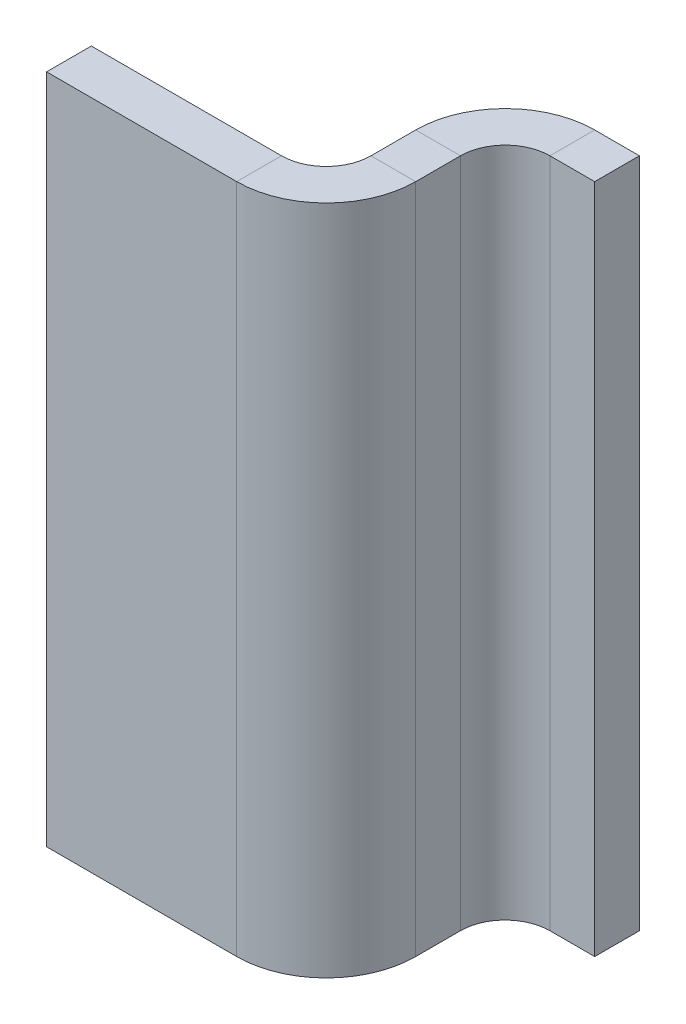
ISO-10303-21;
HEADER;
FILE_DESCRIPTION(('STEP AP214'),'2;1');
FILE_NAME('part.step','',(''),(''),'','','');
FILE_SCHEMA(('AUTOMOTIVE_DESIGN { 1 0 10303 214 1 1 1 1 }'));
ENDSEC;
DATA;
#1=APPLICATION_CONTEXT('core data for automotive mechanical design processes');
#2=APPLICATION_PROTOCOL_DEFINITION('international standard','automotive_design',2000,#1);
#3=PRODUCT_CONTEXT('',#1,'mechanical');
#4=PRODUCT('Part','Part','',(#3));
#5=PRODUCT_RELATED_PRODUCT_CATEGORY('part','',(#4));
#6=PRODUCT_DEFINITION_FORMATION('','',#4);
#7=PRODUCT_DEFINITION_CONTEXT('part definition',#1,'design');
#8=PRODUCT_DEFINITION('design','',#6,#7);
#9=PRODUCT_DEFINITION_SHAPE('','',#8);
#10=(LENGTH_UNIT() NAMED_UNIT(*) SI_UNIT(.MILLI.,.METRE.));
#11=(NAMED_UNIT(*) PLANE_ANGLE_UNIT() SI_UNIT($,.RADIAN.));
#12=(NAMED_UNIT(*) SI_UNIT($,.STERADIAN.) SOLID_ANGLE_UNIT());
#13=UNCERTAINTY_MEASURE_WITH_UNIT(LENGTH_MEASURE(1.E-05),#10,'distance_accuracy_value','');
#14=(GEOMETRIC_REPRESENTATION_CONTEXT(3) GLOBAL_UNCERTAINTY_ASSIGNED_CONTEXT((#13)) GLOBAL_UNIT_ASSIGNED_CONTEXT((#10,
#11,#12)) REPRESENTATION_CONTEXT('',''));
#15=CARTESIAN_POINT('',(0.,0.,0.));
#16=DIRECTION('',(0.,0.,1.));
#17=DIRECTION('',(1.,0.,0.));
#18=AXIS2_PLACEMENT_3D('',#15,#16,#17);
#19=CARTESIAN_POINT('',(1.65,-1.5,0.));
#20=DIRECTION('',(-1.,0.,0.));
#21=DIRECTION('',(0.,0.,1.));
#22=AXIS2_PLACEMENT_3D('',#19,#20,#21);
#23=PLANE('',#22);
#24=DIRECTION('',(0.,-1.,0.));
#25=VECTOR('',#24,1.);
#26=CARTESIAN_POINT('',(1.65,-1.5,0.));
#27=LINE('',#26,#25);
#28=CARTESIAN_POINT('',(1.65,1.5,0.));
#29=VERTEX_POINT('',#28);
#30=CARTESIAN_POINT('',(1.65,-1.5,0.));
#31=VERTEX_POINT('',#30);
#32=EDGE_CURVE('E223',#29,#31,#27,.T.);
#33=ORIENTED_EDGE('',*,*,#32,.F.);
#34=DIRECTION('',(0.,0.,-1.));
#35=VECTOR('',#34,1.);
#36=CARTESIAN_POINT('',(1.65,1.5,0.));
#37=LINE('',#36,#35);
#38=CARTESIAN_POINT('',(1.65,1.5,0.2));
#39=VERTEX_POINT('',#38);
#40=EDGE_CURVE('E11',#39,#29,#37,.T.);
#41=ORIENTED_EDGE('',*,*,#40,.F.);
#42=DIRECTION('',(0.,1.,0.));
#43=VECTOR('',#42,1.);
#44=CARTESIAN_POINT('',(1.65,1.5,0.2));
#45=LINE('',#44,#43);
#46=CARTESIAN_POINT('',(1.65,-1.5,0.2));
#47=VERTEX_POINT('',#46);
#48=EDGE_CURVE('E159',#47,#39,#45,.T.);
#49=ORIENTED_EDGE('',*,*,#48,.F.);
#50=DIRECTION('',(0.,0.,1.));
#51=VECTOR('',#50,1.);
#52=CARTESIAN_POINT('',(1.65,-1.5,0.2));
#53=LINE('',#52,#51);
#54=EDGE_CURVE('E240',#31,#47,#53,.T.);
#55=ORIENTED_EDGE('',*,*,#54,.F.);
#56=EDGE_LOOP('',(#33,#41,#49,#55));
#57=FACE_BOUND('',#56,.T.);
#58=ADVANCED_FACE('F16',(#57),#23,.F.);
#59=CARTESIAN_POINT('',(1.45,1.5,0.));
#60=DIRECTION('',(0.,-1.,0.));
#61=DIRECTION('',(0.,0.,-1.));
#62=AXIS2_PLACEMENT_3D('',#59,#60,#61);
#63=PLANE('',#62);
#64=ORIENTED_EDGE('',*,*,#40,.T.);
#65=DIRECTION('',(1.,0.,0.));
#66=VECTOR('',#65,1.);
#67=CARTESIAN_POINT('',(1.45,1.5,0.));
#68=LINE('',#67,#66);
#69=CARTESIAN_POINT('',(1.45,1.5,0.));
#70=VERTEX_POINT('',#69);
#71=EDGE_CURVE('E234',#70,#29,#68,.T.);
#72=ORIENTED_EDGE('',*,*,#71,.F.);
#73=DIRECTION('',(0.,0.,-1.));
#74=VECTOR('',#73,1.);
#75=CARTESIAN_POINT('',(1.45,1.5,0.));
#76=LINE('',#75,#74);
#77=CARTESIAN_POINT('',(1.45,1.5,0.2));
#78=VERTEX_POINT('',#77);
#79=EDGE_CURVE('E27',#78,#70,#76,.T.);
#80=ORIENTED_EDGE('',*,*,#79,.F.);
#81=DIRECTION('',(1.,0.,0.));
#82=VECTOR('',#81,1.);
#83=CARTESIAN_POINT('',(1.45,1.5,0.2));
#84=LINE('',#83,#82);
#85=EDGE_CURVE('E202',#78,#39,#84,.T.);
#86=ORIENTED_EDGE('',*,*,#85,.T.);
#87=EDGE_LOOP('',(#64,#72,#80,#86));
#88=FACE_BOUND('',#87,.T.);
#89=ADVANCED_FACE('F344',(#88),#63,.F.);
#90=CARTESIAN_POINT('',(1.237867965644,1.5,0.187867965644));
#91=DIRECTION('',(0.,1.,0.));
#92=DIRECTION('',(1.,0.,0.));
#93=AXIS2_PLACEMENT_3D('',#90,#91,#92);
#94=PLANE('',#93);
#95=CARTESIAN_POINT('',(1.45,1.5,0.4));
#96=DIRECTION('',(0.,-1.,0.));
#97=DIRECTION('',(0.,0.,-1.));
#98=AXIS2_PLACEMENT_3D('',#95,#96,#97);
#99=CIRCLE('',#98,0.2);
#100=CARTESIAN_POINT('',(1.25,1.5,0.4));
#101=VERTEX_POINT('',#100);
#102=EDGE_CURVE('E142',#101,#78,#99,.T.);
#103=ORIENTED_EDGE('',*,*,#102,.T.);
#104=ORIENTED_EDGE('',*,*,#79,.T.);
#105=CARTESIAN_POINT('',(1.45,1.5,0.4));
#106=DIRECTION('',(0.,-1.,0.));
#107=DIRECTION('',(0.,0.,-1.));
#108=AXIS2_PLACEMENT_3D('',#105,#106,#107);
#109=CIRCLE('',#108,0.4);
#110=CARTESIAN_POINT('',(1.05,1.5,0.4));
#111=VERTEX_POINT('',#110);
#112=EDGE_CURVE('E20',#111,#70,#109,.T.);
#113=ORIENTED_EDGE('',*,*,#112,.F.);
#114=DIRECTION('',(-1.,0.,0.));
#115=VECTOR('',#114,1.);
#116=CARTESIAN_POINT('',(1.05,1.5,0.4));
#117=LINE('',#116,#115);
#118=EDGE_CURVE('E139',#101,#111,#117,.T.);
#119=ORIENTED_EDGE('',*,*,#118,.F.);
#120=EDGE_LOOP('',(#103,#104,#113,#119));
#121=FACE_BOUND('',#120,.T.);
#122=ADVANCED_FACE('F141',(#121),#94,.T.);
#123=CARTESIAN_POINT('',(1.05,1.5,0.6));
#124=DIRECTION('',(0.,-1.,0.));
#125=DIRECTION('',(0.,0.,-1.));
#126=AXIS2_PLACEMENT_3D('',#123,#124,#125);
#127=PLANE('',#126);
#128=ORIENTED_EDGE('',*,*,#118,.T.);
#129=DIRECTION('',(0.,0.,-1.));
#130=VECTOR('',#129,1.);
#131=CARTESIAN_POINT('',(1.05,1.5,0.6));
#132=LINE('',#131,#130);
#133=CARTESIAN_POINT('',(1.05,1.5,0.6));
#134=VERTEX_POINT('',#133);
#135=EDGE_CURVE('E227',#134,#111,#132,.T.);
#136=ORIENTED_EDGE('',*,*,#135,.F.);
#137=DIRECTION('',(-1.,0.,0.));
#138=VECTOR('',#137,1.);
#139=CARTESIAN_POINT('',(1.05,1.5,0.6));
#140=LINE('',#139,#138);
#141=CARTESIAN_POINT('',(1.25,1.5,0.6));
#142=VERTEX_POINT('',#141);
#143=EDGE_CURVE('E150',#142,#134,#140,.T.);
#144=ORIENTED_EDGE('',*,*,#143,.F.);
#145=DIRECTION('',(0.,0.,-1.));
#146=VECTOR('',#145,1.);
#147=CARTESIAN_POINT('',(1.25,1.5,0.6));
#148=LINE('',#147,#146);
#149=EDGE_CURVE('E162',#142,#101,#148,.T.);
#150=ORIENTED_EDGE('',*,*,#149,.T.);
#151=EDGE_LOOP('',(#128,#136,#144,#150));
#152=FACE_BOUND('',#151,.T.);
#153=ADVANCED_FACE('F163',(#152),#127,.F.);
#154=CARTESIAN_POINT('',(1.062132034356,1.5,0.812132034356));
#155=DIRECTION('',(0.,1.,0.));
#156=DIRECTION('',(1.,0.,0.));
#157=AXIS2_PLACEMENT_3D('',#154,#155,#156);
#158=PLANE('',#157);
#159=CARTESIAN_POINT('',(0.85,1.5,0.6));
#160=DIRECTION('',(0.,1.,0.));
#161=DIRECTION('',(0.,0.,-1.));
#162=AXIS2_PLACEMENT_3D('',#159,#160,#161);
#163=CIRCLE('',#162,0.4);
#164=CARTESIAN_POINT('',(0.85,1.5,1.));
#165=VERTEX_POINT('',#164);
#166=EDGE_CURVE('E175',#165,#142,#163,.T.);
#167=ORIENTED_EDGE('',*,*,#166,.T.);
#168=ORIENTED_EDGE('',*,*,#143,.T.);
#169=CARTESIAN_POINT('',(0.85,1.5,0.6));
#170=DIRECTION('',(0.,1.,0.));
#171=DIRECTION('',(0.,0.,-1.));
#172=AXIS2_PLACEMENT_3D('',#169,#170,#171);
#173=CIRCLE('',#172,0.2);
#174=CARTESIAN_POINT('',(0.85,1.5,0.8));
#175=VERTEX_POINT('',#174);
#176=EDGE_CURVE('E264',#175,#134,#173,.T.);
#177=ORIENTED_EDGE('',*,*,#176,.F.);
#178=DIRECTION('',(0.,0.,-1.));
#179=VECTOR('',#178,1.);
#180=CARTESIAN_POINT('',(0.85,1.5,0.8));
#181=LINE('',#180,#179);
#182=EDGE_CURVE('E205',#165,#175,#181,.T.);
#183=ORIENTED_EDGE('',*,*,#182,.F.);
#184=EDGE_LOOP('',(#167,#168,#177,#183));
#185=FACE_BOUND('',#184,.T.);
#186=ADVANCED_FACE('F388',(#185),#158,.T.);
#187=CARTESIAN_POINT('',(0.,1.5,0.8));
#188=DIRECTION('',(0.,-1.,0.));
#189=DIRECTION('',(0.,0.,-1.));
#190=AXIS2_PLACEMENT_3D('',#187,#188,#189);
#191=PLANE('',#190);
#192=ORIENTED_EDGE('',*,*,#182,.T.);
#193=DIRECTION('',(1.,0.,0.));
#194=VECTOR('',#193,1.);
#195=CARTESIAN_POINT('',(0.,1.5,0.8));
#196=LINE('',#195,#194);
#197=CARTESIAN_POINT('',(0.,1.5,0.8));
#198=VERTEX_POINT('',#197);
#199=EDGE_CURVE('E215',#198,#175,#196,.T.);
#200=ORIENTED_EDGE('',*,*,#199,.F.);
#201=DIRECTION('',(0.,0.,-1.));
#202=VECTOR('',#201,1.);
#203=CARTESIAN_POINT('',(0.,1.5,0.8));
#204=LINE('',#203,#202);
#205=CARTESIAN_POINT('',(0.,1.5,1.));
#206=VERTEX_POINT('',#205);
#207=EDGE_CURVE('E201',#206,#198,#204,.T.);
#208=ORIENTED_EDGE('',*,*,#207,.F.);
#209=DIRECTION('',(1.,0.,0.));
#210=VECTOR('',#209,1.);
#211=CARTESIAN_POINT('',(0.,1.5,1.));
#212=LINE('',#211,#210);
#213=EDGE_CURVE('E252',#206,#165,#212,.T.);
#214=ORIENTED_EDGE('',*,*,#213,.T.);
#215=EDGE_LOOP('',(#192,#200,#208,#214));
#216=FACE_BOUND('',#215,.T.);
#217=ADVANCED_FACE('F298',(#216),#191,.F.);
#218=CARTESIAN_POINT('',(1.45,1.5,0.2));
#219=DIRECTION('',(0.,0.,-1.));
#220=DIRECTION('',(0.,-1.,0.));
#221=AXIS2_PLACEMENT_3D('',#218,#219,#220);
#222=PLANE('',#221);
#223=ORIENTED_EDGE('',*,*,#48,.T.);
#224=ORIENTED_EDGE('',*,*,#85,.F.);
#225=DIRECTION('',(0.,-1.,0.));
#226=VECTOR('',#225,1.);
#227=CARTESIAN_POINT('',(1.45,1.5,0.2));
#228=LINE('',#227,#226);
#229=CARTESIAN_POINT('',(1.45,-1.5,0.2));
#230=VERTEX_POINT('',#229);
#231=EDGE_CURVE('E157',#78,#230,#228,.T.);
#232=ORIENTED_EDGE('',*,*,#231,.T.);
#233=DIRECTION('',(1.,0.,0.));
#234=VECTOR('',#233,1.);
#235=CARTESIAN_POINT('',(1.45,-1.5,0.2));
#236=LINE('',#235,#234);
#237=EDGE_CURVE('E244',#230,#47,#236,.T.);
#238=ORIENTED_EDGE('',*,*,#237,.T.);
#239=EDGE_LOOP('',(#223,#224,#232,#238));
#240=FACE_BOUND('',#239,.T.);
#241=ADVANCED_FACE('F401',(#240),#222,.F.);
#242=CARTESIAN_POINT('',(1.45,1.5,0.4));
#243=DIRECTION('',(0.,-1.,0.));
#244=DIRECTION('',(0.,0.,-1.));
#245=AXIS2_PLACEMENT_3D('',#242,#243,#244);
#246=CYLINDRICAL_SURFACE('',#245,0.2);
#247=ORIENTED_EDGE('',*,*,#231,.F.);
#248=ORIENTED_EDGE('',*,*,#102,.F.);
#249=DIRECTION('',(0.,1.,0.));
#250=VECTOR('',#249,1.);
#251=CARTESIAN_POINT('',(1.25,1.5,0.4));
#252=LINE('',#251,#250);
#253=CARTESIAN_POINT('',(1.25,-1.5,0.4));
#254=VERTEX_POINT('',#253);
#255=EDGE_CURVE('E155',#254,#101,#252,.T.);
#256=ORIENTED_EDGE('',*,*,#255,.F.);
#257=CARTESIAN_POINT('',(1.45,-1.5,0.4));
#258=DIRECTION('',(0.,-1.,0.));
#259=DIRECTION('',(0.,0.,-1.));
#260=AXIS2_PLACEMENT_3D('',#257,#258,#259);
#261=CIRCLE('',#260,0.2);
#262=EDGE_CURVE('E237',#254,#230,#261,.T.);
#263=ORIENTED_EDGE('',*,*,#262,.T.);
#264=EDGE_LOOP('',(#247,#248,#256,#263));
#265=FACE_BOUND('',#264,.T.);
#266=ADVANCED_FACE('F18',(#265),#246,.F.);
#267=CARTESIAN_POINT('',(1.25,1.5,0.6));
#268=DIRECTION('',(-1.,0.,0.));
#269=DIRECTION('',(0.,0.,1.));
#270=AXIS2_PLACEMENT_3D('',#267,#268,#269);
#271=PLANE('',#270);
#272=ORIENTED_EDGE('',*,*,#255,.T.);
#273=ORIENTED_EDGE('',*,*,#149,.F.);
#274=DIRECTION('',(0.,1.,0.));
#275=VECTOR('',#274,1.);
#276=CARTESIAN_POINT('',(1.25,1.5,0.6));
#277=LINE('',#276,#275);
#278=CARTESIAN_POINT('',(1.25,-1.5,0.6));
#279=VERTEX_POINT('',#278);
#280=EDGE_CURVE('E181',#279,#142,#277,.T.);
#281=ORIENTED_EDGE('',*,*,#280,.F.);
#282=DIRECTION('',(0.,0.,-1.));
#283=VECTOR('',#282,1.);
#284=CARTESIAN_POINT('',(1.25,-1.5,0.6));
#285=LINE('',#284,#283);
#286=EDGE_CURVE('E172',#279,#254,#285,.T.);
#287=ORIENTED_EDGE('',*,*,#286,.T.);
#288=EDGE_LOOP('',(#272,#273,#281,#287));
#289=FACE_BOUND('',#288,.T.);
#290=ADVANCED_FACE('F170',(#289),#271,.F.);
#291=CARTESIAN_POINT('',(0.85,1.5,0.6));
#292=DIRECTION('',(0.,1.,0.));
#293=DIRECTION('',(0.,0.,-1.));
#294=AXIS2_PLACEMENT_3D('',#291,#292,#293);
#295=CYLINDRICAL_SURFACE('',#294,0.4);
#296=CARTESIAN_POINT('',(0.85,-1.5,0.6));
#297=DIRECTION('',(0.,1.,0.));
#298=DIRECTION('',(0.,0.,-1.));
#299=AXIS2_PLACEMENT_3D('',#296,#297,#298);
#300=CIRCLE('',#299,0.4);
#301=CARTESIAN_POINT('',(0.85,-1.5,1.));
#302=VERTEX_POINT('',#301);
#303=EDGE_CURVE('E226',#302,#279,#300,.T.);
#304=ORIENTED_EDGE('',*,*,#303,.T.);
#305=ORIENTED_EDGE('',*,*,#280,.T.);
#306=ORIENTED_EDGE('',*,*,#166,.F.);
#307=DIRECTION('',(0.,1.,0.));
#308=VECTOR('',#307,1.);
#309=CARTESIAN_POINT('',(0.85,1.5,1.));
#310=LINE('',#309,#308);
#311=EDGE_CURVE('E248',#302,#165,#310,.T.);
#312=ORIENTED_EDGE('',*,*,#311,.F.);
#313=EDGE_LOOP('',(#304,#305,#306,#312));
#314=FACE_BOUND('',#313,.T.);
#315=ADVANCED_FACE('F339',(#314),#295,.T.);
#316=CARTESIAN_POINT('',(0.,1.5,1.));
#317=DIRECTION('',(0.,0.,-1.));
#318=DIRECTION('',(0.,-1.,0.));
#319=AXIS2_PLACEMENT_3D('',#316,#317,#318);
#320=PLANE('',#319);
#321=ORIENTED_EDGE('',*,*,#311,.T.);
#322=ORIENTED_EDGE('',*,*,#213,.F.);
#323=DIRECTION('',(0.,1.,0.));
#324=VECTOR('',#323,1.);
#325=CARTESIAN_POINT('',(0.,1.5,1.));
#326=LINE('',#325,#324);
#327=CARTESIAN_POINT('',(0.,-1.5,1.));
#328=VERTEX_POINT('',#327);
#329=EDGE_CURVE('E190',#328,#206,#326,.T.);
#330=ORIENTED_EDGE('',*,*,#329,.F.);
#331=DIRECTION('',(1.,0.,0.));
#332=VECTOR('',#331,1.);
#333=CARTESIAN_POINT('',(0.,-1.5,1.));
#334=LINE('',#333,#332);
#335=EDGE_CURVE('E307',#328,#302,#334,.T.);
#336=ORIENTED_EDGE('',*,*,#335,.T.);
#337=EDGE_LOOP('',(#321,#322,#330,#336));
#338=FACE_BOUND('',#337,.T.);
#339=ADVANCED_FACE('F310',(#338),#320,.F.);
#340=CARTESIAN_POINT('',(1.45,-1.5,0.2));
#341=DIRECTION('',(0.,1.,0.));
#342=DIRECTION('',(1.,0.,0.));
#343=AXIS2_PLACEMENT_3D('',#340,#341,#342);
#344=PLANE('',#343);
#345=ORIENTED_EDGE('',*,*,#54,.T.);
#346=ORIENTED_EDGE('',*,*,#237,.F.);
#347=DIRECTION('',(0.,0.,1.));
#348=VECTOR('',#347,1.);
#349=CARTESIAN_POINT('',(1.45,-1.5,0.2));
#350=LINE('',#349,#348);
#351=CARTESIAN_POINT('',(1.45,-1.5,0.));
#352=VERTEX_POINT('',#351);
#353=EDGE_CURVE('E74',#352,#230,#350,.T.);
#354=ORIENTED_EDGE('',*,*,#353,.F.);
#355=DIRECTION('',(1.,0.,0.));
#356=VECTOR('',#355,1.);
#357=CARTESIAN_POINT('',(1.45,-1.5,0.));
#358=LINE('',#357,#356);
#359=EDGE_CURVE('E231',#352,#31,#358,.T.);
#360=ORIENTED_EDGE('',*,*,#359,.T.);
#361=EDGE_LOOP('',(#345,#346,#354,#360));
#362=FACE_BOUND('',#361,.T.);
#363=ADVANCED_FACE('F327',(#362),#344,.F.);
#364=CARTESIAN_POINT('',(1.237867965644,-1.5,0.187867965644));
#365=DIRECTION('',(0.,-1.,0.));
#366=DIRECTION('',(0.,0.,-1.));
#367=AXIS2_PLACEMENT_3D('',#364,#365,#366);
#368=PLANE('',#367);
#369=CARTESIAN_POINT('',(1.45,-1.5,0.4));
#370=DIRECTION('',(0.,-1.,0.));
#371=DIRECTION('',(0.,0.,-1.));
#372=AXIS2_PLACEMENT_3D('',#369,#370,#371);
#373=CIRCLE('',#372,0.4);
#374=CARTESIAN_POINT('',(1.05,-1.5,0.4));
#375=VERTEX_POINT('',#374);
#376=EDGE_CURVE('E194',#375,#352,#373,.T.);
#377=ORIENTED_EDGE('',*,*,#376,.T.);
#378=ORIENTED_EDGE('',*,*,#353,.T.);
#379=ORIENTED_EDGE('',*,*,#262,.F.);
#380=DIRECTION('',(1.,0.,0.));
#381=VECTOR('',#380,1.);
#382=CARTESIAN_POINT('',(1.25,-1.5,0.4));
#383=LINE('',#382,#381);
#384=EDGE_CURVE('E208',#375,#254,#383,.T.);
#385=ORIENTED_EDGE('',*,*,#384,.F.);
#386=EDGE_LOOP('',(#377,#378,#379,#385));
#387=FACE_BOUND('',#386,.T.);
#388=ADVANCED_FACE('F329',(#387),#368,.T.);
#389=CARTESIAN_POINT('',(1.25,-1.5,0.6));
#390=DIRECTION('',(0.,1.,0.));
#391=DIRECTION('',(1.,0.,0.));
#392=AXIS2_PLACEMENT_3D('',#389,#390,#391);
#393=PLANE('',#392);
#394=ORIENTED_EDGE('',*,*,#384,.T.);
#395=ORIENTED_EDGE('',*,*,#286,.F.);
#396=DIRECTION('',(1.,0.,0.));
#397=VECTOR('',#396,1.);
#398=CARTESIAN_POINT('',(1.25,-1.5,0.6));
#399=LINE('',#398,#397);
#400=CARTESIAN_POINT('',(1.05,-1.5,0.6));
#401=VERTEX_POINT('',#400);
#402=EDGE_CURVE('E185',#401,#279,#399,.T.);
#403=ORIENTED_EDGE('',*,*,#402,.F.);
#404=DIRECTION('',(0.,0.,-1.));
#405=VECTOR('',#404,1.);
#406=CARTESIAN_POINT('',(1.05,-1.5,0.6));
#407=LINE('',#406,#405);
#408=EDGE_CURVE('E230',#401,#375,#407,.T.);
#409=ORIENTED_EDGE('',*,*,#408,.T.);
#410=EDGE_LOOP('',(#394,#395,#403,#409));
#411=FACE_BOUND('',#410,.T.);
#412=ADVANCED_FACE('F336',(#411),#393,.F.);
#413=CARTESIAN_POINT('',(1.062132034356,-1.5,0.812132034356));
#414=DIRECTION('',(0.,-1.,0.));
#415=DIRECTION('',(0.,0.,-1.));
#416=AXIS2_PLACEMENT_3D('',#413,#414,#415);
#417=PLANE('',#416);
#418=CARTESIAN_POINT('',(0.85,-1.5,0.6));
#419=DIRECTION('',(0.,1.,0.));
#420=DIRECTION('',(0.,0.,-1.));
#421=AXIS2_PLACEMENT_3D('',#418,#419,#420);
#422=CIRCLE('',#421,0.2);
#423=CARTESIAN_POINT('',(0.85,-1.5,0.8));
#424=VERTEX_POINT('',#423);
#425=EDGE_CURVE('E269',#424,#401,#422,.T.);
#426=ORIENTED_EDGE('',*,*,#425,.T.);
#427=ORIENTED_EDGE('',*,*,#402,.T.);
#428=ORIENTED_EDGE('',*,*,#303,.F.);
#429=DIRECTION('',(0.,0.,1.));
#430=VECTOR('',#429,1.);
#431=CARTESIAN_POINT('',(0.85,-1.5,1.));
#432=LINE('',#431,#430);
#433=EDGE_CURVE('E279',#424,#302,#432,.T.);
#434=ORIENTED_EDGE('',*,*,#433,.F.);
#435=EDGE_LOOP('',(#426,#427,#428,#434));
#436=FACE_BOUND('',#435,.T.);
#437=ADVANCED_FACE('F380',(#436),#417,.T.);
#438=CARTESIAN_POINT('',(0.,-1.5,1.));
#439=DIRECTION('',(0.,1.,0.));
#440=DIRECTION('',(1.,0.,0.));
#441=AXIS2_PLACEMENT_3D('',#438,#439,#440);
#442=PLANE('',#441);
#443=ORIENTED_EDGE('',*,*,#433,.T.);
#444=ORIENTED_EDGE('',*,*,#335,.F.);
#445=DIRECTION('',(0.,0.,1.));
#446=VECTOR('',#445,1.);
#447=CARTESIAN_POINT('',(0.,-1.5,1.));
#448=LINE('',#447,#446);
#449=CARTESIAN_POINT('',(0.,-1.5,0.8));
#450=VERTEX_POINT('',#449);
#451=EDGE_CURVE('E187',#450,#328,#448,.T.);
#452=ORIENTED_EDGE('',*,*,#451,.F.);
#453=DIRECTION('',(1.,0.,0.));
#454=VECTOR('',#453,1.);
#455=CARTESIAN_POINT('',(0.,-1.5,0.8));
#456=LINE('',#455,#454);
#457=EDGE_CURVE('E211',#450,#424,#456,.T.);
#458=ORIENTED_EDGE('',*,*,#457,.T.);
#459=EDGE_LOOP('',(#443,#444,#452,#458));
#460=FACE_BOUND('',#459,.T.);
#461=ADVANCED_FACE('F305',(#460),#442,.F.);
#462=CARTESIAN_POINT('',(1.45,-1.5,0.));
#463=DIRECTION('',(0.,0.,1.));
#464=DIRECTION('',(1.,0.,0.));
#465=AXIS2_PLACEMENT_3D('',#462,#463,#464);
#466=PLANE('',#465);
#467=ORIENTED_EDGE('',*,*,#32,.T.);
#468=ORIENTED_EDGE('',*,*,#359,.F.);
#469=DIRECTION('',(0.,-1.,0.));
#470=VECTOR('',#469,1.);
#471=CARTESIAN_POINT('',(1.45,-1.5,0.));
#472=LINE('',#471,#470);
#473=EDGE_CURVE('E191',#70,#352,#472,.T.);
#474=ORIENTED_EDGE('',*,*,#473,.F.);
#475=ORIENTED_EDGE('',*,*,#71,.T.);
#476=EDGE_LOOP('',(#467,#468,#474,#475));
#477=FACE_BOUND('',#476,.T.);
#478=ADVANCED_FACE('F325',(#477),#466,.F.);
#479=CARTESIAN_POINT('',(1.45,-1.5,0.4));
#480=DIRECTION('',(0.,-1.,0.));
#481=DIRECTION('',(0.,0.,-1.));
#482=AXIS2_PLACEMENT_3D('',#479,#480,#481);
#483=CYLINDRICAL_SURFACE('',#482,0.4);
#484=ORIENTED_EDGE('',*,*,#112,.T.);
#485=ORIENTED_EDGE('',*,*,#473,.T.);
#486=ORIENTED_EDGE('',*,*,#376,.F.);
#487=DIRECTION('',(0.,-1.,0.));
#488=VECTOR('',#487,1.);
#489=CARTESIAN_POINT('',(1.05,-1.5,0.4));
#490=LINE('',#489,#488);
#491=EDGE_CURVE('E261',#111,#375,#490,.T.);
#492=ORIENTED_EDGE('',*,*,#491,.F.);
#493=EDGE_LOOP('',(#484,#485,#486,#492));
#494=FACE_BOUND('',#493,.T.);
#495=ADVANCED_FACE('F362',(#494),#483,.T.);
#496=CARTESIAN_POINT('',(1.05,-1.5,0.6));
#497=DIRECTION('',(1.,0.,0.));
#498=DIRECTION('',(0.,1.,0.));
#499=AXIS2_PLACEMENT_3D('',#496,#497,#498);
#500=PLANE('',#499);
#501=ORIENTED_EDGE('',*,*,#491,.T.);
#502=ORIENTED_EDGE('',*,*,#408,.F.);
#503=DIRECTION('',(0.,1.,0.));
#504=VECTOR('',#503,1.);
#505=CARTESIAN_POINT('',(1.05,-1.5,0.6));
#506=LINE('',#505,#504);
#507=EDGE_CURVE('E219',#401,#134,#506,.T.);
#508=ORIENTED_EDGE('',*,*,#507,.T.);
#509=ORIENTED_EDGE('',*,*,#135,.T.);
#510=EDGE_LOOP('',(#501,#502,#508,#509));
#511=FACE_BOUND('',#510,.T.);
#512=ADVANCED_FACE('F359',(#511),#500,.F.);
#513=CARTESIAN_POINT('',(0.85,-1.5,0.6));
#514=DIRECTION('',(0.,1.,0.));
#515=DIRECTION('',(0.,0.,-1.));
#516=AXIS2_PLACEMENT_3D('',#513,#514,#515);
#517=CYLINDRICAL_SURFACE('',#516,0.2);
#518=ORIENTED_EDGE('',*,*,#507,.F.);
#519=ORIENTED_EDGE('',*,*,#425,.F.);
#520=DIRECTION('',(0.,-1.,0.));
#521=VECTOR('',#520,1.);
#522=CARTESIAN_POINT('',(0.85,-1.5,0.8));
#523=LINE('',#522,#521);
#524=EDGE_CURVE('E200',#175,#424,#523,.T.);
#525=ORIENTED_EDGE('',*,*,#524,.F.);
#526=ORIENTED_EDGE('',*,*,#176,.T.);
#527=EDGE_LOOP('',(#518,#519,#525,#526));
#528=FACE_BOUND('',#527,.T.);
#529=ADVANCED_FACE('F355',(#528),#517,.F.);
#530=CARTESIAN_POINT('',(0.,-1.5,0.8));
#531=DIRECTION('',(0.,0.,1.));
#532=DIRECTION('',(1.,0.,0.));
#533=AXIS2_PLACEMENT_3D('',#530,#531,#532);
#534=PLANE('',#533);
#535=ORIENTED_EDGE('',*,*,#524,.T.);
#536=ORIENTED_EDGE('',*,*,#457,.F.);
#537=DIRECTION('',(0.,-1.,0.));
#538=VECTOR('',#537,1.);
#539=CARTESIAN_POINT('',(0.,-1.5,0.8));
#540=LINE('',#539,#538);
#541=EDGE_CURVE('E196',#198,#450,#540,.T.);
#542=ORIENTED_EDGE('',*,*,#541,.F.);
#543=ORIENTED_EDGE('',*,*,#199,.T.);
#544=EDGE_LOOP('',(#535,#536,#542,#543));
#545=FACE_BOUND('',#544,.T.);
#546=ADVANCED_FACE('F302',(#545),#534,.F.);
#547=CARTESIAN_POINT('',(0.,-1.5,0.8));
#548=DIRECTION('',(-1.,0.,0.));
#549=DIRECTION('',(0.,0.,1.));
#550=AXIS2_PLACEMENT_3D('',#547,#548,#549);
#551=PLANE('',#550);
#552=ORIENTED_EDGE('',*,*,#451,.T.);
#553=ORIENTED_EDGE('',*,*,#329,.T.);
#554=ORIENTED_EDGE('',*,*,#207,.T.);
#555=ORIENTED_EDGE('',*,*,#541,.T.);
#556=EDGE_LOOP('',(#552,#553,#554,#555));
#557=FACE_BOUND('',#556,.T.);
#558=ADVANCED_FACE('F292',(#557),#551,.T.);
#559=CLOSED_SHELL('',(#58,#89,#122,#153,#186,#217,#241,#266,#290,#315,#339,#363,#388,#412,#437,
#461,#478,#495,#512,#529,#546,#558));
#560=MANIFOLD_SOLID_BREP('B1',#559);
#561=ADVANCED_BREP_SHAPE_REPRESENTATION('',(#18,#560),#14);
#562=SHAPE_DEFINITION_REPRESENTATION(#9,#561);
ENDSEC;
END-ISO-10303-21;
